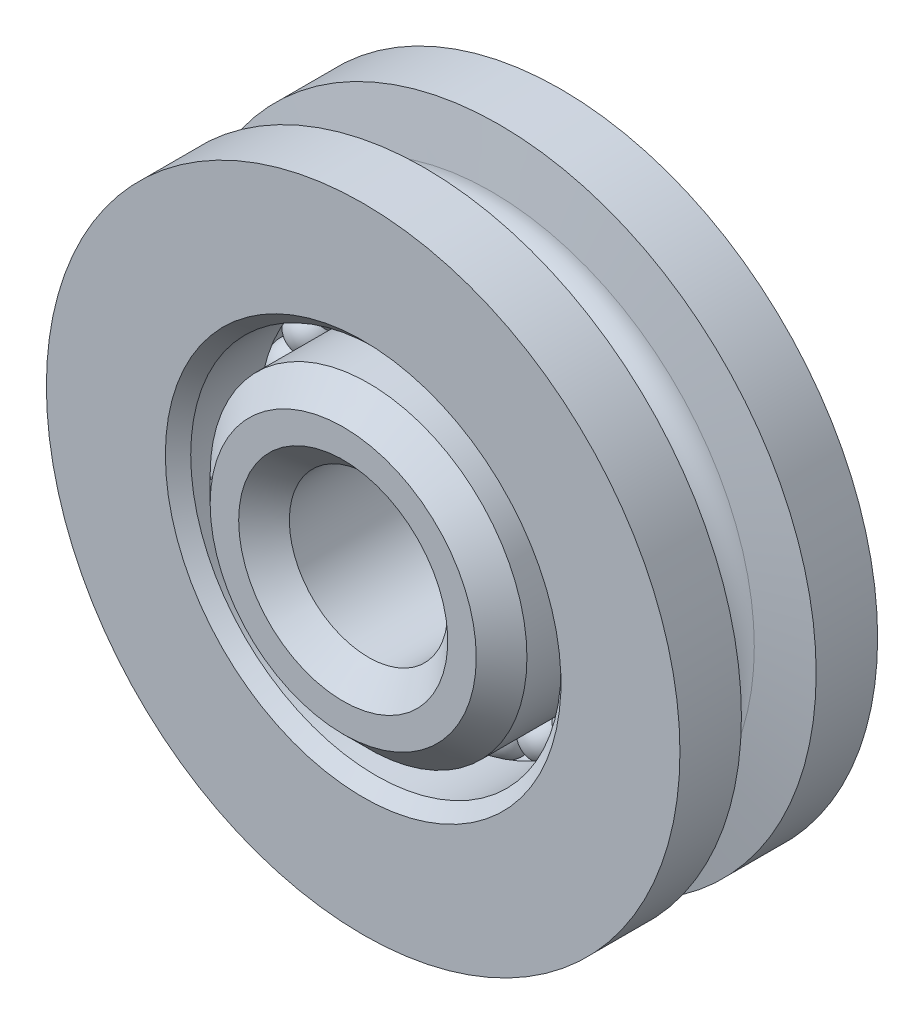
ISO-10303-21;
HEADER;
FILE_DESCRIPTION(('STEP AP214'),'2;1');
FILE_NAME('part.step','',(''),(''),'','','');
FILE_SCHEMA(('AUTOMOTIVE_DESIGN { 1 0 10303 214 1 1 1 1 }'));
ENDSEC;
DATA;
#1=APPLICATION_CONTEXT('core data for automotive mechanical design processes');
#2=APPLICATION_PROTOCOL_DEFINITION('international standard','automotive_design',2000,#1);
#3=PRODUCT_CONTEXT('',#1,'mechanical');
#4=PRODUCT('Part','Part','',(#3));
#5=PRODUCT_RELATED_PRODUCT_CATEGORY('part','',(#4));
#6=PRODUCT_DEFINITION_FORMATION('','',#4);
#7=PRODUCT_DEFINITION_CONTEXT('part definition',#1,'design');
#8=PRODUCT_DEFINITION('design','',#6,#7);
#9=PRODUCT_DEFINITION_SHAPE('','',#8);
#10=(LENGTH_UNIT() NAMED_UNIT(*) SI_UNIT(.MILLI.,.METRE.));
#11=(NAMED_UNIT(*) PLANE_ANGLE_UNIT() SI_UNIT($,.RADIAN.));
#12=(NAMED_UNIT(*) SI_UNIT($,.STERADIAN.) SOLID_ANGLE_UNIT());
#13=UNCERTAINTY_MEASURE_WITH_UNIT(LENGTH_MEASURE(1.E-05),#10,'distance_accuracy_value','');
#14=(GEOMETRIC_REPRESENTATION_CONTEXT(3) GLOBAL_UNCERTAINTY_ASSIGNED_CONTEXT((#13)) GLOBAL_UNIT_ASSIGNED_CONTEXT((#10,
#11,#12)) REPRESENTATION_CONTEXT('',''));
#15=CARTESIAN_POINT('',(0.,0.,0.));
#16=DIRECTION('',(0.,0.,1.));
#17=DIRECTION('',(1.,0.,0.));
#18=AXIS2_PLACEMENT_3D('',#15,#16,#17);
#19=CARTESIAN_POINT('',(0.891085663954876,3.32557697177602,0.));
#20=DIRECTION('',(0.258819045102508,0.965925826289072,0.));
#21=DIRECTION('',(0.,0.,-1.));
#22=AXIS2_PLACEMENT_3D('',#19,#20,#21);
#23=SPHERICAL_SURFACE('',#22,0.446484375);
#24=CARTESIAN_POINT('',(1.00664432354557,3.75684776062306,0.));
#25=VERTEX_POINT('',#24);
#26=VERTEX_LOOP('',#25);
#27=FACE_BOUND('',#26,.T.);
#28=ADVANCED_FACE('F37',(#27),#23,.T.);
#29=CLOSED_SHELL('',(#28));
#30=MANIFOLD_SOLID_BREP('B2',#29);
#31=CARTESIAN_POINT('',(1.72144531249996,2.9816307437013,0.));
#32=DIRECTION('',(0.499999999999989,0.866025403784445,0.));
#33=DIRECTION('',(0.,0.,-1.));
#34=AXIS2_PLACEMENT_3D('',#31,#32,#33);
#35=SPHERICAL_SURFACE('',#34,0.446484375);
#36=CARTESIAN_POINT('',(1.94468749999996,3.36829755484413,0.));
#37=VERTEX_POINT('',#36);
#38=VERTEX_LOOP('',#37);
#39=FACE_BOUND('',#38,.T.);
#40=ADVANCED_FACE('F55',(#39),#35,.T.);
#41=CLOSED_SHELL('',(#40));
#42=MANIFOLD_SOLID_BREP('B6',#41);
#43=CARTESIAN_POINT('',(2.43449130782106,2.43449130782112,0.));
#44=DIRECTION('',(0.707106781186539,0.707106781186556,0.));
#45=DIRECTION('',(0.,0.,-1.));
#46=AXIS2_PLACEMENT_3D('',#43,#44,#45);
#47=SPHERICAL_SURFACE('',#46,0.446484375);
#48=CARTESIAN_POINT('',(2.75020343707739,2.75020343707746,0.));
#49=VERTEX_POINT('',#48);
#50=VERTEX_LOOP('',#49);
#51=FACE_BOUND('',#50,.T.);
#52=ADVANCED_FACE('F73',(#51),#47,.T.);
#53=CLOSED_SHELL('',(#52));
#54=MANIFOLD_SOLID_BREP('B33',#53);
#55=CARTESIAN_POINT('',(2.98163074370126,1.72144531250003,0.));
#56=DIRECTION('',(0.866025403784433,0.50000000000001,0.));
#57=DIRECTION('',(0.,0.,-1.));
#58=AXIS2_PLACEMENT_3D('',#55,#56,#57);
#59=SPHERICAL_SURFACE('',#58,0.446484375);
#60=CARTESIAN_POINT('',(3.36829755484408,1.94468750000004,0.));
#61=VERTEX_POINT('',#60);
#62=VERTEX_LOOP('',#61);
#63=FACE_BOUND('',#62,.T.);
#64=ADVANCED_FACE('F91',(#63),#59,.T.);
#65=CLOSED_SHELL('',(#64));
#66=MANIFOLD_SOLID_BREP('B51',#65);
#67=CARTESIAN_POINT('',(3.325576971776,0.891085663954958,0.));
#68=DIRECTION('',(0.965925826289065,0.258819045102531,0.));
#69=DIRECTION('',(0.,0.,-1.));
#70=AXIS2_PLACEMENT_3D('',#67,#68,#69);
#71=SPHERICAL_SURFACE('',#70,0.446484375);
#72=CARTESIAN_POINT('',(3.75684776062303,1.00664432354566,0.));
#73=VERTEX_POINT('',#72);
#74=VERTEX_LOOP('',#73);
#75=FACE_BOUND('',#74,.T.);
#76=ADVANCED_FACE('F109',(#75),#71,.T.);
#77=CLOSED_SHELL('',(#76));
#78=MANIFOLD_SOLID_BREP('B69',#77);
#79=CARTESIAN_POINT('',(3.442890625,0.,0.));
#80=DIRECTION('',(1.,0.,0.));
#81=DIRECTION('',(0.,0.,-1.));
#82=AXIS2_PLACEMENT_3D('',#79,#80,#81);
#83=SPHERICAL_SURFACE('',#82,0.446484375);
#84=CARTESIAN_POINT('',(3.889375,0.,0.));
#85=VERTEX_POINT('',#84);
#86=VERTEX_LOOP('',#85);
#87=FACE_BOUND('',#86,.T.);
#88=ADVANCED_FACE('F127',(#87),#83,.T.);
#89=CLOSED_SHELL('',(#88));
#90=MANIFOLD_SOLID_BREP('B87',#89);
#91=CARTESIAN_POINT('',(3.32557697177602,-0.891085663954888,0.));
#92=DIRECTION('',(0.965925826289071,-0.258819045102511,0.));
#93=DIRECTION('',(0.,0.,-1.));
#94=AXIS2_PLACEMENT_3D('',#91,#92,#93);
#95=SPHERICAL_SURFACE('',#94,0.446484375);
#96=CARTESIAN_POINT('',(3.75684776062305,-1.00664432354558,0.));
#97=VERTEX_POINT('',#96);
#98=VERTEX_LOOP('',#97);
#99=FACE_BOUND('',#98,.T.);
#100=ADVANCED_FACE('F145',(#99),#95,.T.);
#101=CLOSED_SHELL('',(#100));
#102=MANIFOLD_SOLID_BREP('B105',#101);
#103=CARTESIAN_POINT('',(2.9816307437013,-1.72144531249997,0.));
#104=DIRECTION('',(0.866025403784443,-0.499999999999992,0.));
#105=DIRECTION('',(0.,0.,-1.));
#106=AXIS2_PLACEMENT_3D('',#103,#104,#105);
#107=SPHERICAL_SURFACE('',#106,0.446484375);
#108=CARTESIAN_POINT('',(3.36829755484412,-1.94468749999997,0.));
#109=VERTEX_POINT('',#108);
#110=VERTEX_LOOP('',#109);
#111=FACE_BOUND('',#110,.T.);
#112=ADVANCED_FACE('F163',(#111),#107,.T.);
#113=CLOSED_SHELL('',(#112));
#114=MANIFOLD_SOLID_BREP('B123',#113);
#115=CARTESIAN_POINT('',(2.43449130782111,-2.43449130782107,0.));
#116=DIRECTION('',(0.707106781186554,-0.707106781186541,0.));
#117=DIRECTION('',(0.,0.,-1.));
#118=AXIS2_PLACEMENT_3D('',#115,#116,#117);
#119=SPHERICAL_SURFACE('',#118,0.446484375);
#120=CARTESIAN_POINT('',(2.75020343707745,-2.7502034370774,0.));
#121=VERTEX_POINT('',#120);
#122=VERTEX_LOOP('',#121);
#123=FACE_BOUND('',#122,.T.);
#124=ADVANCED_FACE('F181',(#123),#119,.T.);
#125=CLOSED_SHELL('',(#124));
#126=MANIFOLD_SOLID_BREP('B141',#125);
#127=CARTESIAN_POINT('',(1.72144531250002,-2.98163074370127,0.));
#128=DIRECTION('',(0.500000000000007,-0.866025403784435,0.));
#129=DIRECTION('',(0.,0.,-1.));
#130=AXIS2_PLACEMENT_3D('',#127,#128,#129);
#131=SPHERICAL_SURFACE('',#130,0.446484375);
#132=CARTESIAN_POINT('',(1.94468750000003,-3.36829755484408,0.));
#133=VERTEX_POINT('',#132);
#134=VERTEX_LOOP('',#133);
#135=FACE_BOUND('',#134,.T.);
#136=ADVANCED_FACE('F199',(#135),#131,.T.);
#137=CLOSED_SHELL('',(#136));
#138=MANIFOLD_SOLID_BREP('B159',#137);
#139=CARTESIAN_POINT('',(0.891085663954946,-3.325576971776,0.));
#140=DIRECTION('',(0.258819045102528,-0.965925826289066,0.));
#141=DIRECTION('',(0.,0.,-1.));
#142=AXIS2_PLACEMENT_3D('',#139,#140,#141);
#143=SPHERICAL_SURFACE('',#142,0.446484375);
#144=CARTESIAN_POINT('',(1.00664432354565,-3.75684776062304,0.));
#145=VERTEX_POINT('',#144);
#146=VERTEX_LOOP('',#145);
#147=FACE_BOUND('',#146,.T.);
#148=ADVANCED_FACE('F217',(#147),#143,.T.);
#149=CLOSED_SHELL('',(#148));
#150=MANIFOLD_SOLID_BREP('B177',#149);
#151=CARTESIAN_POINT('',(0.,-3.442890625,0.));
#152=DIRECTION('',(0.,-1.,0.));
#153=DIRECTION('',(0.,0.,-1.));
#154=AXIS2_PLACEMENT_3D('',#151,#152,#153);
#155=SPHERICAL_SURFACE('',#154,0.446484375);
#156=CARTESIAN_POINT('',(0.,-3.889375,0.));
#157=VERTEX_POINT('',#156);
#158=VERTEX_LOOP('',#157);
#159=FACE_BOUND('',#158,.T.);
#160=ADVANCED_FACE('F235',(#159),#155,.T.);
#161=CLOSED_SHELL('',(#160));
#162=MANIFOLD_SOLID_BREP('B195',#161);
#163=CARTESIAN_POINT('',(-0.891085663954899,-3.32557697177602,0.));
#164=DIRECTION('',(-0.258819045102515,-0.96592582628907,0.));
#165=DIRECTION('',(0.,0.,-1.));
#166=AXIS2_PLACEMENT_3D('',#163,#164,#165);
#167=SPHERICAL_SURFACE('',#166,0.446484375);
#168=CARTESIAN_POINT('',(-1.00664432354559,-3.75684776062305,0.));
#169=VERTEX_POINT('',#168);
#170=VERTEX_LOOP('',#169);
#171=FACE_BOUND('',#170,.T.);
#172=ADVANCED_FACE('F253',(#171),#167,.T.);
#173=CLOSED_SHELL('',(#172));
#174=MANIFOLD_SOLID_BREP('B213',#173);
#175=CARTESIAN_POINT('',(-1.72144531249998,-2.98163074370129,0.));
#176=DIRECTION('',(-0.499999999999995,-0.866025403784442,0.));
#177=DIRECTION('',(0.,0.,-1.));
#178=AXIS2_PLACEMENT_3D('',#175,#176,#177);
#179=SPHERICAL_SURFACE('',#178,0.446484375);
#180=CARTESIAN_POINT('',(-1.94468749999998,-3.36829755484411,0.));
#181=VERTEX_POINT('',#180);
#182=VERTEX_LOOP('',#181);
#183=FACE_BOUND('',#182,.T.);
#184=ADVANCED_FACE('F271',(#183),#179,.T.);
#185=CLOSED_SHELL('',(#184));
#186=MANIFOLD_SOLID_BREP('B231',#185);
#187=CARTESIAN_POINT('',(-2.43449130782108,-2.4344913078211,0.));
#188=DIRECTION('',(-0.707106781186544,-0.707106781186551,0.));
#189=DIRECTION('',(0.,0.,-1.));
#190=AXIS2_PLACEMENT_3D('',#187,#188,#189);
#191=SPHERICAL_SURFACE('',#190,0.446484375);
#192=CARTESIAN_POINT('',(-2.75020343707741,-2.75020343707744,0.));
#193=VERTEX_POINT('',#192);
#194=VERTEX_LOOP('',#193);
#195=FACE_BOUND('',#194,.T.);
#196=ADVANCED_FACE('F289',(#195),#191,.T.);
#197=CLOSED_SHELL('',(#196));
#198=MANIFOLD_SOLID_BREP('B249',#197);
#199=CARTESIAN_POINT('',(-2.98163074370128,-1.72144531250001,0.));
#200=DIRECTION('',(-0.866025403784436,-0.500000000000004,0.));
#201=DIRECTION('',(0.,0.,-1.));
#202=AXIS2_PLACEMENT_3D('',#199,#200,#201);
#203=SPHERICAL_SURFACE('',#202,0.446484375);
#204=CARTESIAN_POINT('',(-3.36829755484409,-1.94468750000002,0.));
#205=VERTEX_POINT('',#204);
#206=VERTEX_LOOP('',#205);
#207=FACE_BOUND('',#206,.T.);
#208=ADVANCED_FACE('F307',(#207),#203,.T.);
#209=CLOSED_SHELL('',(#208));
#210=MANIFOLD_SOLID_BREP('B267',#209);
#211=CARTESIAN_POINT('',(-3.32557697177601,-0.891085663954934,0.));
#212=DIRECTION('',(-0.965925826289067,-0.258819045102525,0.));
#213=DIRECTION('',(0.,0.,-1.));
#214=AXIS2_PLACEMENT_3D('',#211,#212,#213);
#215=SPHERICAL_SURFACE('',#214,0.446484375);
#216=CARTESIAN_POINT('',(-3.75684776062304,-1.00664432354563,0.));
#217=VERTEX_POINT('',#216);
#218=VERTEX_LOOP('',#217);
#219=FACE_BOUND('',#218,.T.);
#220=ADVANCED_FACE('F325',(#219),#215,.T.);
#221=CLOSED_SHELL('',(#220));
#222=MANIFOLD_SOLID_BREP('B285',#221);
#223=CARTESIAN_POINT('',(-3.442890625,0.,0.));
#224=DIRECTION('',(-1.,0.,0.));
#225=DIRECTION('',(0.,0.,-1.));
#226=AXIS2_PLACEMENT_3D('',#223,#224,#225);
#227=SPHERICAL_SURFACE('',#226,0.446484375);
#228=CARTESIAN_POINT('',(-3.889375,0.,0.));
#229=VERTEX_POINT('',#228);
#230=VERTEX_LOOP('',#229);
#231=FACE_BOUND('',#230,.T.);
#232=ADVANCED_FACE('F343',(#231),#227,.T.);
#233=CLOSED_SHELL('',(#232));
#234=MANIFOLD_SOLID_BREP('B303',#233);
#235=CARTESIAN_POINT('',(-3.32557697177601,0.891085663954911,0.));
#236=DIRECTION('',(-0.965925826289069,0.258819045102518,0.));
#237=DIRECTION('',(0.,0.,-1.));
#238=AXIS2_PLACEMENT_3D('',#235,#236,#237);
#239=SPHERICAL_SURFACE('',#238,0.446484375);
#240=CARTESIAN_POINT('',(-3.75684776062305,1.00664432354561,0.));
#241=VERTEX_POINT('',#240);
#242=VERTEX_LOOP('',#241);
#243=FACE_BOUND('',#242,.T.);
#244=ADVANCED_FACE('F361',(#243),#239,.T.);
#245=CLOSED_SHELL('',(#244));
#246=MANIFOLD_SOLID_BREP('B321',#245);
#247=CARTESIAN_POINT('',(-2.98163074370129,1.72144531249999,0.));
#248=DIRECTION('',(-0.86602540378444,0.499999999999998,0.));
#249=DIRECTION('',(0.,0.,-1.));
#250=AXIS2_PLACEMENT_3D('',#247,#248,#249);
#251=SPHERICAL_SURFACE('',#250,0.446484375);
#252=CARTESIAN_POINT('',(-3.36829755484411,1.94468749999999,0.));
#253=VERTEX_POINT('',#252);
#254=VERTEX_LOOP('',#253);
#255=FACE_BOUND('',#254,.T.);
#256=ADVANCED_FACE('F379',(#255),#251,.T.);
#257=CLOSED_SHELL('',(#256));
#258=MANIFOLD_SOLID_BREP('B339',#257);
#259=CARTESIAN_POINT('',(-2.43449130782109,2.43449130782109,0.));
#260=DIRECTION('',(-0.707106781186549,0.707106781186546,0.));
#261=DIRECTION('',(0.,0.,-1.));
#262=AXIS2_PLACEMENT_3D('',#259,#260,#261);
#263=SPHERICAL_SURFACE('',#262,0.446484375);
#264=CARTESIAN_POINT('',(-2.75020343707743,2.75020343707742,0.));
#265=VERTEX_POINT('',#264);
#266=VERTEX_LOOP('',#265);
#267=FACE_BOUND('',#266,.T.);
#268=ADVANCED_FACE('F397',(#267),#263,.T.);
#269=CLOSED_SHELL('',(#268));
#270=MANIFOLD_SOLID_BREP('B357',#269);
#271=CARTESIAN_POINT('',(-1.7214453125,2.98163074370128,0.));
#272=DIRECTION('',(-0.500000000000001,0.866025403784438,0.));
#273=DIRECTION('',(0.,0.,-1.));
#274=AXIS2_PLACEMENT_3D('',#271,#272,#273);
#275=SPHERICAL_SURFACE('',#274,0.446484375);
#276=CARTESIAN_POINT('',(-1.9446875,3.3682975548441,0.));
#277=VERTEX_POINT('',#276);
#278=VERTEX_LOOP('',#277);
#279=FACE_BOUND('',#278,.T.);
#280=ADVANCED_FACE('F415',(#279),#275,.T.);
#281=CLOSED_SHELL('',(#280));
#282=MANIFOLD_SOLID_BREP('B375',#281);
#283=CARTESIAN_POINT('',(-0.891085663954923,3.32557697177601,0.));
#284=DIRECTION('',(-0.258819045102521,0.965925826289068,0.));
#285=DIRECTION('',(0.,0.,-1.));
#286=AXIS2_PLACEMENT_3D('',#283,#284,#285);
#287=SPHERICAL_SURFACE('',#286,0.446484375);
#288=CARTESIAN_POINT('',(-1.00664432354562,3.75684776062304,0.));
#289=VERTEX_POINT('',#288);
#290=VERTEX_LOOP('',#289);
#291=FACE_BOUND('',#290,.T.);
#292=ADVANCED_FACE('F433',(#291),#287,.T.);
#293=CLOSED_SHELL('',(#292));
#294=MANIFOLD_SOLID_BREP('B393',#293);
#295=CARTESIAN_POINT('',(0.,3.442890625,0.));
#296=DIRECTION('',(0.,1.,0.));
#297=DIRECTION('',(0.,0.,-1.));
#298=AXIS2_PLACEMENT_3D('',#295,#296,#297);
#299=SPHERICAL_SURFACE('',#298,0.446484375);
#300=CARTESIAN_POINT('',(0.,3.889375,0.));
#301=VERTEX_POINT('',#300);
#302=VERTEX_LOOP('',#301);
#303=FACE_BOUND('',#302,.T.);
#304=ADVANCED_FACE('F453',(#303),#299,.T.);
#305=CLOSED_SHELL('',(#304));
#306=MANIFOLD_SOLID_BREP('B411',#305);
#307=CARTESIAN_POINT('',(0.,3.175,2.38125));
#308=DIRECTION('',(0.,0.,-1.));
#309=DIRECTION('',(-1.,0.,0.));
#310=AXIS2_PLACEMENT_3D('',#307,#308,#309);
#311=PLANE('',#310);
#312=CARTESIAN_POINT('',(0.,0.,2.38125));
#313=DIRECTION('',(0.,0.,-1.));
#314=DIRECTION('',(-1.,0.,0.));
#315=AXIS2_PLACEMENT_3D('',#312,#313,#314);
#316=CIRCLE('',#315,2.667);
#317=CARTESIAN_POINT('',(-2.667,0.,2.38125));
#318=VERTEX_POINT('',#317);
#319=EDGE_CURVE('E479',#318,#318,#316,.F.);
#320=ORIENTED_EDGE('',*,*,#319,.T.);
#321=EDGE_LOOP('',(#320));
#322=FACE_BOUND('',#321,.T.);
#323=CARTESIAN_POINT('',(0.,0.,2.38125));
#324=DIRECTION('',(0.,0.,-1.));
#325=DIRECTION('',(-1.,0.,0.));
#326=AXIS2_PLACEMENT_3D('',#323,#324,#325);
#327=CIRCLE('',#326,2.0955);
#328=CARTESIAN_POINT('',(-2.0955,0.,2.38125));
#329=VERTEX_POINT('',#328);
#330=EDGE_CURVE('E483',#329,#329,#327,.T.);
#331=ORIENTED_EDGE('',*,*,#330,.T.);
#332=EDGE_LOOP('',(#331));
#333=FACE_BOUND('',#332,.T.);
#334=ADVANCED_FACE('F472',(#322,#333),#311,.F.);
#335=CARTESIAN_POINT('',(0.,0.,2.38125));
#336=DIRECTION('',(0.,0.,1.));
#337=DIRECTION('',(1.,0.,0.));
#338=AXIS2_PLACEMENT_3D('',#335,#336,#337);
#339=CYLINDRICAL_SURFACE('',#338,1.5875);
#340=CARTESIAN_POINT('',(0.,0.,-1.87325));
#341=DIRECTION('',(0.,0.,1.));
#342=DIRECTION('',(1.,0.,0.));
#343=AXIS2_PLACEMENT_3D('',#340,#341,#342);
#344=CIRCLE('',#343,1.5875);
#345=CARTESIAN_POINT('',(1.5875,0.,-1.87325));
#346=VERTEX_POINT('',#345);
#347=EDGE_CURVE('E492',#346,#346,#344,.F.);
#348=ORIENTED_EDGE('',*,*,#347,.T.);
#349=EDGE_LOOP('',(#348));
#350=FACE_BOUND('',#349,.T.);
#351=CARTESIAN_POINT('',(0.,0.,1.87325));
#352=DIRECTION('',(0.,0.,-1.));
#353=DIRECTION('',(-1.,0.,0.));
#354=AXIS2_PLACEMENT_3D('',#351,#352,#353);
#355=CIRCLE('',#354,1.5875);
#356=CARTESIAN_POINT('',(-1.5875,0.,1.87325));
#357=VERTEX_POINT('',#356);
#358=EDGE_CURVE('E495',#357,#357,#355,.F.);
#359=ORIENTED_EDGE('',*,*,#358,.T.);
#360=EDGE_LOOP('',(#359));
#361=FACE_BOUND('',#360,.T.);
#362=ADVANCED_FACE('F527',(#350,#361),#339,.F.);
#363=CARTESIAN_POINT('',(0.,3.175,-2.38125));
#364=DIRECTION('',(0.,0.,1.));
#365=DIRECTION('',(1.,0.,0.));
#366=AXIS2_PLACEMENT_3D('',#363,#364,#365);
#367=PLANE('',#366);
#368=CARTESIAN_POINT('',(0.,0.,-2.38125));
#369=DIRECTION('',(0.,0.,1.));
#370=DIRECTION('',(1.,0.,0.));
#371=AXIS2_PLACEMENT_3D('',#368,#369,#370);
#372=CIRCLE('',#371,2.0955);
#373=CARTESIAN_POINT('',(2.0955,0.,-2.38125));
#374=VERTEX_POINT('',#373);
#375=EDGE_CURVE('E498',#374,#374,#372,.T.);
#376=ORIENTED_EDGE('',*,*,#375,.T.);
#377=EDGE_LOOP('',(#376));
#378=FACE_BOUND('',#377,.T.);
#379=CARTESIAN_POINT('',(0.,0.,-2.38125));
#380=DIRECTION('',(0.,0.,1.));
#381=DIRECTION('',(1.,0.,0.));
#382=AXIS2_PLACEMENT_3D('',#379,#380,#381);
#383=CIRCLE('',#382,2.667);
#384=CARTESIAN_POINT('',(2.667,0.,-2.38125));
#385=VERTEX_POINT('',#384);
#386=EDGE_CURVE('E501',#385,#385,#383,.F.);
#387=ORIENTED_EDGE('',*,*,#386,.T.);
#388=EDGE_LOOP('',(#387));
#389=FACE_BOUND('',#388,.T.);
#390=ADVANCED_FACE('F521',(#378,#389),#367,.F.);
#391=CARTESIAN_POINT('',(0.,0.,2.38125));
#392=DIRECTION('',(0.,0.,1.));
#393=DIRECTION('',(1.,0.,0.));
#394=AXIS2_PLACEMENT_3D('',#391,#392,#393);
#395=CYLINDRICAL_SURFACE('',#394,3.175);
#396=CARTESIAN_POINT('',(0.,0.,-1.87325));
#397=DIRECTION('',(0.,0.,1.));
#398=DIRECTION('',(1.,0.,0.));
#399=AXIS2_PLACEMENT_3D('',#396,#397,#398);
#400=CIRCLE('',#399,3.175);
#401=CARTESIAN_POINT('',(3.175,0.,-1.87325));
#402=VERTEX_POINT('',#401);
#403=EDGE_CURVE('E487',#402,#402,#400,.T.);
#404=ORIENTED_EDGE('',*,*,#403,.T.);
#405=EDGE_LOOP('',(#404));
#406=FACE_BOUND('',#405,.T.);
#407=CARTESIAN_POINT('',(0.,0.,-0.3571875));
#408=DIRECTION('',(0.,0.,1.));
#409=DIRECTION('',(1.,0.,0.));
#410=AXIS2_PLACEMENT_3D('',#407,#408,#409);
#411=CIRCLE('',#410,3.175);
#412=CARTESIAN_POINT('',(3.175,0.,-0.3571875));
#413=VERTEX_POINT('',#412);
#414=EDGE_CURVE('E504',#413,#413,#411,.T.);
#415=ORIENTED_EDGE('',*,*,#414,.F.);
#416=EDGE_LOOP('',(#415));
#417=FACE_BOUND('',#416,.T.);
#418=ADVANCED_FACE('F516',(#406,#417),#395,.T.);
#419=CARTESIAN_POINT('',(0.,0.,0.));
#420=DIRECTION('',(0.,0.,1.));
#421=DIRECTION('',(1.,0.,0.));
#422=AXIS2_PLACEMENT_3D('',#419,#420,#421);
#423=TOROIDAL_SURFACE('',#422,3.442890625,0.446484375);
#424=CARTESIAN_POINT('',(0.,0.,0.3571875));
#425=DIRECTION('',(0.,0.,1.));
#426=DIRECTION('',(1.,0.,0.));
#427=AXIS2_PLACEMENT_3D('',#424,#425,#426);
#428=CIRCLE('',#427,3.175);
#429=CARTESIAN_POINT('',(3.175,0.,0.3571875));
#430=VERTEX_POINT('',#429);
#431=EDGE_CURVE('E507',#430,#430,#428,.T.);
#432=ORIENTED_EDGE('',*,*,#431,.F.);
#433=EDGE_LOOP('',(#432));
#434=FACE_BOUND('',#433,.T.);
#435=ORIENTED_EDGE('',*,*,#414,.T.);
#436=EDGE_LOOP('',(#435));
#437=FACE_BOUND('',#436,.T.);
#438=ADVANCED_FACE('F513',(#434,#437),#423,.F.);
#439=CARTESIAN_POINT('',(0.,0.,2.38125));
#440=DIRECTION('',(0.,0.,1.));
#441=DIRECTION('',(1.,0.,0.));
#442=AXIS2_PLACEMENT_3D('',#439,#440,#441);
#443=CYLINDRICAL_SURFACE('',#442,3.175);
#444=CARTESIAN_POINT('',(0.,0.,1.87325));
#445=DIRECTION('',(0.,0.,-1.));
#446=DIRECTION('',(-1.,0.,0.));
#447=AXIS2_PLACEMENT_3D('',#444,#445,#446);
#448=CIRCLE('',#447,3.175);
#449=CARTESIAN_POINT('',(-3.175,0.,1.87325));
#450=VERTEX_POINT('',#449);
#451=EDGE_CURVE('E452',#450,#450,#448,.T.);
#452=ORIENTED_EDGE('',*,*,#451,.T.);
#453=EDGE_LOOP('',(#452));
#454=FACE_BOUND('',#453,.T.);
#455=ORIENTED_EDGE('',*,*,#431,.T.);
#456=EDGE_LOOP('',(#455));
#457=FACE_BOUND('',#456,.T.);
#458=ADVANCED_FACE('F511',(#454,#457),#443,.T.);
#459=CARTESIAN_POINT('',(0.,0.,-2.38125));
#460=DIRECTION('',(0.,0.,-1.));
#461=DIRECTION('',(-1.,0.,0.));
#462=AXIS2_PLACEMENT_3D('',#459,#460,#461);
#463=CONICAL_SURFACE('',#462,2.0955,0.785398163397446);
#464=ORIENTED_EDGE('',*,*,#347,.F.);
#465=EDGE_LOOP('',(#464));
#466=FACE_BOUND('',#465,.T.);
#467=ORIENTED_EDGE('',*,*,#375,.F.);
#468=EDGE_LOOP('',(#467));
#469=FACE_BOUND('',#468,.T.);
#470=ADVANCED_FACE('F539',(#466,#469),#463,.F.);
#471=CARTESIAN_POINT('',(0.,0.,-1.87325));
#472=DIRECTION('',(0.,0.,1.));
#473=DIRECTION('',(1.,0.,0.));
#474=AXIS2_PLACEMENT_3D('',#471,#472,#473);
#475=CONICAL_SURFACE('',#474,3.175,0.78539816339745);
#476=ORIENTED_EDGE('',*,*,#386,.F.);
#477=EDGE_LOOP('',(#476));
#478=FACE_BOUND('',#477,.T.);
#479=ORIENTED_EDGE('',*,*,#403,.F.);
#480=EDGE_LOOP('',(#479));
#481=FACE_BOUND('',#480,.T.);
#482=ADVANCED_FACE('F542',(#478,#481),#475,.T.);
#483=CARTESIAN_POINT('',(0.,0.,2.38125));
#484=DIRECTION('',(0.,0.,-1.));
#485=DIRECTION('',(-1.,0.,0.));
#486=AXIS2_PLACEMENT_3D('',#483,#484,#485);
#487=CONICAL_SURFACE('',#486,2.667,0.785398163397447);
#488=ORIENTED_EDGE('',*,*,#451,.F.);
#489=EDGE_LOOP('',(#488));
#490=FACE_BOUND('',#489,.T.);
#491=ORIENTED_EDGE('',*,*,#319,.F.);
#492=EDGE_LOOP('',(#491));
#493=FACE_BOUND('',#492,.T.);
#494=ADVANCED_FACE('F545',(#490,#493),#487,.T.);
#495=CARTESIAN_POINT('',(0.,0.,1.87325));
#496=DIRECTION('',(0.,0.,1.));
#497=DIRECTION('',(1.,0.,0.));
#498=AXIS2_PLACEMENT_3D('',#495,#496,#497);
#499=CONICAL_SURFACE('',#498,1.5875,0.785398163397449);
#500=ORIENTED_EDGE('',*,*,#330,.F.);
#501=EDGE_LOOP('',(#500));
#502=FACE_BOUND('',#501,.T.);
#503=ORIENTED_EDGE('',*,*,#358,.F.);
#504=EDGE_LOOP('',(#503));
#505=FACE_BOUND('',#504,.T.);
#506=ADVANCED_FACE('F474',(#502,#505),#499,.F.);
#507=CLOSED_SHELL('',(#334,#362,#390,#418,#438,#458,#470,#482,#494,#506));
#508=MANIFOLD_SOLID_BREP('B429',#507);
#509=CARTESIAN_POINT('',(0.,0.,0.));
#510=DIRECTION('',(0.,0.,1.));
#511=DIRECTION('',(1.,0.,0.));
#512=AXIS2_PLACEMENT_3D('',#509,#510,#511);
#513=TOROIDAL_SURFACE('',#512,5.3578125,0.5953125);
#514=CARTESIAN_POINT('',(0.,0.,0.58884564576447));
#515=DIRECTION('',(0.,0.,1.));
#516=DIRECTION('',(1.,0.,0.));
#517=AXIS2_PLACEMENT_3D('',#514,#515,#516);
#518=CIRCLE('',#517,5.27030376831867);
#519=CARTESIAN_POINT('',(5.27030376831867,0.,0.58884564576447));
#520=VERTEX_POINT('',#519);
#521=EDGE_CURVE('E643',#520,#520,#518,.T.);
#522=ORIENTED_EDGE('',*,*,#521,.F.);
#523=EDGE_LOOP('',(#522));
#524=FACE_BOUND('',#523,.T.);
#525=CARTESIAN_POINT('',(0.,0.,-0.58884564576447));
#526=DIRECTION('',(0.,0.,1.));
#527=DIRECTION('',(1.,0.,0.));
#528=AXIS2_PLACEMENT_3D('',#525,#526,#527);
#529=CIRCLE('',#528,5.27030376831867);
#530=CARTESIAN_POINT('',(5.27030376831867,0.,-0.58884564576447));
#531=VERTEX_POINT('',#530);
#532=EDGE_CURVE('E664',#531,#531,#529,.T.);
#533=ORIENTED_EDGE('',*,*,#532,.T.);
#534=EDGE_LOOP('',(#533));
#535=FACE_BOUND('',#534,.T.);
#536=ADVANCED_FACE('F623',(#524,#535),#513,.F.);
#537=CARTESIAN_POINT('',(0.,0.,0.58884564576447));
#538=DIRECTION('',(0.,0.,1.));
#539=DIRECTION('',(1.,0.,0.));
#540=AXIS2_PLACEMENT_3D('',#537,#538,#539);
#541=CONICAL_SURFACE('',#540,5.27030376831867,1.42326543698228);
#542=CARTESIAN_POINT('',(0.,0.,0.7493));
#543=DIRECTION('',(0.,0.,1.));
#544=DIRECTION('',(1.,0.,0.));
#545=AXIS2_PLACEMENT_3D('',#542,#543,#544);
#546=CIRCLE('',#545,6.35);
#547=CARTESIAN_POINT('',(6.35,0.,0.7493));
#548=VERTEX_POINT('',#547);
#549=EDGE_CURVE('E646',#548,#548,#546,.T.);
#550=ORIENTED_EDGE('',*,*,#549,.F.);
#551=EDGE_LOOP('',(#550));
#552=FACE_BOUND('',#551,.T.);
#553=ORIENTED_EDGE('',*,*,#521,.T.);
#554=EDGE_LOOP('',(#553));
#555=FACE_BOUND('',#554,.T.);
#556=ADVANCED_FACE('F694',(#552,#555),#541,.T.);
#557=CARTESIAN_POINT('',(0.,0.,2.38125));
#558=DIRECTION('',(0.,0.,1.));
#559=DIRECTION('',(1.,0.,0.));
#560=AXIS2_PLACEMENT_3D('',#557,#558,#559);
#561=CYLINDRICAL_SURFACE('',#560,6.35);
#562=CARTESIAN_POINT('',(0.,0.,1.9812));
#563=DIRECTION('',(0.,0.,1.));
#564=DIRECTION('',(1.,0.,0.));
#565=AXIS2_PLACEMENT_3D('',#562,#563,#564);
#566=CIRCLE('',#565,6.35);
#567=CARTESIAN_POINT('',(6.35,0.,1.9812));
#568=VERTEX_POINT('',#567);
#569=EDGE_CURVE('E649',#568,#568,#566,.T.);
#570=ORIENTED_EDGE('',*,*,#569,.F.);
#571=EDGE_LOOP('',(#570));
#572=FACE_BOUND('',#571,.T.);
#573=ORIENTED_EDGE('',*,*,#549,.T.);
#574=EDGE_LOOP('',(#573));
#575=FACE_BOUND('',#574,.T.);
#576=ADVANCED_FACE('F700',(#572,#575),#561,.T.);
#577=CARTESIAN_POINT('',(0.,3.71078125,1.9812));
#578=DIRECTION('',(0.,0.,-1.));
#579=DIRECTION('',(-1.,0.,0.));
#580=AXIS2_PLACEMENT_3D('',#577,#578,#579);
#581=PLANE('',#580);
#582=CARTESIAN_POINT('',(0.,0.,1.9812));
#583=DIRECTION('',(0.,0.,-1.));
#584=DIRECTION('',(-1.,0.,0.));
#585=AXIS2_PLACEMENT_3D('',#582,#583,#584);
#586=CIRCLE('',#585,3.96478125);
#587=CARTESIAN_POINT('',(-3.96478125,0.,1.9812));
#588=VERTEX_POINT('',#587);
#589=EDGE_CURVE('E471',#588,#588,#586,.T.);
#590=ORIENTED_EDGE('',*,*,#589,.T.);
#591=EDGE_LOOP('',(#590));
#592=FACE_BOUND('',#591,.T.);
#593=ORIENTED_EDGE('',*,*,#569,.T.);
#594=EDGE_LOOP('',(#593));
#595=FACE_BOUND('',#594,.T.);
#596=ADVANCED_FACE('F724',(#592,#595),#581,.F.);
#597=CARTESIAN_POINT('',(0.,0.,2.38125));
#598=DIRECTION('',(0.,0.,1.));
#599=DIRECTION('',(1.,0.,0.));
#600=AXIS2_PLACEMENT_3D('',#597,#598,#599);
#601=CYLINDRICAL_SURFACE('',#600,3.71078125);
#602=CARTESIAN_POINT('',(0.,0.,1.7272));
#603=DIRECTION('',(0.,0.,-1.));
#604=DIRECTION('',(-1.,0.,0.));
#605=AXIS2_PLACEMENT_3D('',#602,#603,#604);
#606=CIRCLE('',#605,3.71078125);
#607=CARTESIAN_POINT('',(-3.71078125,0.,1.7272));
#608=VERTEX_POINT('',#607);
#609=EDGE_CURVE('E630',#608,#608,#606,.F.);
#610=ORIENTED_EDGE('',*,*,#609,.T.);
#611=EDGE_LOOP('',(#610));
#612=FACE_BOUND('',#611,.T.);
#613=CARTESIAN_POINT('',(0.,0.,0.3571875));
#614=DIRECTION('',(0.,0.,1.));
#615=DIRECTION('',(1.,0.,0.));
#616=AXIS2_PLACEMENT_3D('',#613,#614,#615);
#617=CIRCLE('',#616,3.71078125);
#618=CARTESIAN_POINT('',(3.71078125,0.,0.3571875));
#619=VERTEX_POINT('',#618);
#620=EDGE_CURVE('E652',#619,#619,#617,.T.);
#621=ORIENTED_EDGE('',*,*,#620,.F.);
#622=EDGE_LOOP('',(#621));
#623=FACE_BOUND('',#622,.T.);
#624=ADVANCED_FACE('F719',(#612,#623),#601,.F.);
#625=CARTESIAN_POINT('',(0.,0.,0.));
#626=DIRECTION('',(0.,0.,1.));
#627=DIRECTION('',(1.,0.,0.));
#628=AXIS2_PLACEMENT_3D('',#625,#626,#627);
#629=TOROIDAL_SURFACE('',#628,3.442890625,0.446484375);
#630=CARTESIAN_POINT('',(0.,0.,-0.3571875));
#631=DIRECTION('',(0.,0.,1.));
#632=DIRECTION('',(1.,0.,0.));
#633=AXIS2_PLACEMENT_3D('',#630,#631,#632);
#634=CIRCLE('',#633,3.71078125);
#635=CARTESIAN_POINT('',(3.71078125,0.,-0.3571875));
#636=VERTEX_POINT('',#635);
#637=EDGE_CURVE('E655',#636,#636,#634,.T.);
#638=ORIENTED_EDGE('',*,*,#637,.F.);
#639=EDGE_LOOP('',(#638));
#640=FACE_BOUND('',#639,.T.);
#641=ORIENTED_EDGE('',*,*,#620,.T.);
#642=EDGE_LOOP('',(#641));
#643=FACE_BOUND('',#642,.T.);
#644=ADVANCED_FACE('F690',(#640,#643),#629,.F.);
#645=CARTESIAN_POINT('',(0.,0.,2.38125));
#646=DIRECTION('',(0.,0.,1.));
#647=DIRECTION('',(1.,0.,0.));
#648=AXIS2_PLACEMENT_3D('',#645,#646,#647);
#649=CYLINDRICAL_SURFACE('',#648,3.71078125);
#650=CARTESIAN_POINT('',(0.,0.,-1.7272));
#651=DIRECTION('',(0.,0.,1.));
#652=DIRECTION('',(1.,0.,0.));
#653=AXIS2_PLACEMENT_3D('',#650,#651,#652);
#654=CIRCLE('',#653,3.71078125);
#655=CARTESIAN_POINT('',(3.71078125,0.,-1.7272));
#656=VERTEX_POINT('',#655);
#657=EDGE_CURVE('E634',#656,#656,#654,.F.);
#658=ORIENTED_EDGE('',*,*,#657,.T.);
#659=EDGE_LOOP('',(#658));
#660=FACE_BOUND('',#659,.T.);
#661=ORIENTED_EDGE('',*,*,#637,.T.);
#662=EDGE_LOOP('',(#661));
#663=FACE_BOUND('',#662,.T.);
#664=ADVANCED_FACE('F684',(#660,#663),#649,.F.);
#665=CARTESIAN_POINT('',(0.,6.35,-1.9812));
#666=DIRECTION('',(0.,0.,1.));
#667=DIRECTION('',(1.,0.,0.));
#668=AXIS2_PLACEMENT_3D('',#665,#666,#667);
#669=PLANE('',#668);
#670=CARTESIAN_POINT('',(0.,0.,-1.9812));
#671=DIRECTION('',(0.,0.,1.));
#672=DIRECTION('',(1.,0.,0.));
#673=AXIS2_PLACEMENT_3D('',#670,#671,#672);
#674=CIRCLE('',#673,3.96478125);
#675=CARTESIAN_POINT('',(3.96478125,0.,-1.9812));
#676=VERTEX_POINT('',#675);
#677=EDGE_CURVE('E638',#676,#676,#674,.T.);
#678=ORIENTED_EDGE('',*,*,#677,.T.);
#679=EDGE_LOOP('',(#678));
#680=FACE_BOUND('',#679,.T.);
#681=CARTESIAN_POINT('',(0.,0.,-1.9812));
#682=DIRECTION('',(0.,0.,1.));
#683=DIRECTION('',(1.,0.,0.));
#684=AXIS2_PLACEMENT_3D('',#681,#682,#683);
#685=CIRCLE('',#684,6.35);
#686=CARTESIAN_POINT('',(6.35,0.,-1.9812));
#687=VERTEX_POINT('',#686);
#688=EDGE_CURVE('E658',#687,#687,#685,.T.);
#689=ORIENTED_EDGE('',*,*,#688,.F.);
#690=EDGE_LOOP('',(#689));
#691=FACE_BOUND('',#690,.T.);
#692=ADVANCED_FACE('F679',(#680,#691),#669,.F.);
#693=CARTESIAN_POINT('',(0.,0.,2.38125));
#694=DIRECTION('',(0.,0.,1.));
#695=DIRECTION('',(1.,0.,0.));
#696=AXIS2_PLACEMENT_3D('',#693,#694,#695);
#697=CYLINDRICAL_SURFACE('',#696,6.35);
#698=CARTESIAN_POINT('',(0.,0.,-0.7493));
#699=DIRECTION('',(0.,0.,1.));
#700=DIRECTION('',(1.,0.,0.));
#701=AXIS2_PLACEMENT_3D('',#698,#699,#700);
#702=CIRCLE('',#701,6.35);
#703=CARTESIAN_POINT('',(6.35,0.,-0.7493));
#704=VERTEX_POINT('',#703);
#705=EDGE_CURVE('E661',#704,#704,#702,.T.);
#706=ORIENTED_EDGE('',*,*,#705,.F.);
#707=EDGE_LOOP('',(#706));
#708=FACE_BOUND('',#707,.T.);
#709=ORIENTED_EDGE('',*,*,#688,.T.);
#710=EDGE_LOOP('',(#709));
#711=FACE_BOUND('',#710,.T.);
#712=ADVANCED_FACE('F673',(#708,#711),#697,.T.);
#713=CARTESIAN_POINT('',(0.,0.,-0.7493));
#714=DIRECTION('',(0.,0.,-1.));
#715=DIRECTION('',(-1.,0.,0.));
#716=AXIS2_PLACEMENT_3D('',#713,#714,#715);
#717=CONICAL_SURFACE('',#716,6.35,1.42326543698228);
#718=ORIENTED_EDGE('',*,*,#532,.F.);
#719=EDGE_LOOP('',(#718));
#720=FACE_BOUND('',#719,.T.);
#721=ORIENTED_EDGE('',*,*,#705,.T.);
#722=EDGE_LOOP('',(#721));
#723=FACE_BOUND('',#722,.T.);
#724=ADVANCED_FACE('F669',(#720,#723),#717,.T.);
#725=CARTESIAN_POINT('',(0.,0.,-1.9812));
#726=DIRECTION('',(0.,0.,-1.));
#727=DIRECTION('',(-1.,0.,0.));
#728=AXIS2_PLACEMENT_3D('',#725,#726,#727);
#729=CONICAL_SURFACE('',#728,3.96478125,0.785398163397447);
#730=ORIENTED_EDGE('',*,*,#657,.F.);
#731=EDGE_LOOP('',(#730));
#732=FACE_BOUND('',#731,.T.);
#733=ORIENTED_EDGE('',*,*,#677,.F.);
#734=EDGE_LOOP('',(#733));
#735=FACE_BOUND('',#734,.T.);
#736=ADVANCED_FACE('F672',(#732,#735),#729,.F.);
#737=CARTESIAN_POINT('',(0.,0.,1.7272));
#738=DIRECTION('',(0.,0.,1.));
#739=DIRECTION('',(1.,0.,0.));
#740=AXIS2_PLACEMENT_3D('',#737,#738,#739);
#741=CONICAL_SURFACE('',#740,3.71078125,0.785398163397452);
#742=ORIENTED_EDGE('',*,*,#589,.F.);
#743=EDGE_LOOP('',(#742));
#744=FACE_BOUND('',#743,.T.);
#745=ORIENTED_EDGE('',*,*,#609,.F.);
#746=EDGE_LOOP('',(#745));
#747=FACE_BOUND('',#746,.T.);
#748=ADVANCED_FACE('F625',(#744,#747),#741,.F.);
#749=CLOSED_SHELL('',(#536,#556,#576,#596,#624,#644,#664,#692,#712,#724,#736,#748));
#750=MANIFOLD_SOLID_BREP('B447',#749);
#751=ADVANCED_BREP_SHAPE_REPRESENTATION('',(#18,#30,#42,#54,#66,#78,#90,#102,#114,#126,#138,
#150,#162,#174,#186,#198,#210,#222,#234,#246,#258,#270,#282,#294,#306,#508,#750),#14);
#752=SHAPE_DEFINITION_REPRESENTATION(#9,#751);
ENDSEC;
END-ISO-10303-21;
